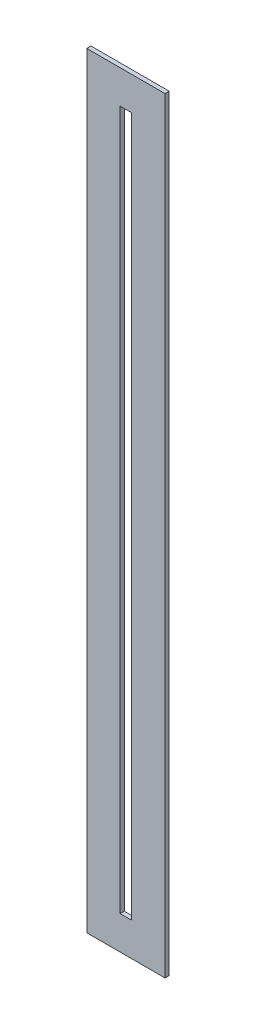
ISO-10303-21;
HEADER;
FILE_DESCRIPTION(('STEP AP214'),'2;1');
FILE_NAME('part.step','',(''),(''),'','','');
FILE_SCHEMA(('AUTOMOTIVE_DESIGN { 1 0 10303 214 1 1 1 1 }'));
ENDSEC;
DATA;
#1=APPLICATION_CONTEXT('core data for automotive mechanical design processes');
#2=APPLICATION_PROTOCOL_DEFINITION('international standard','automotive_design',2000,#1);
#3=PRODUCT_CONTEXT('',#1,'mechanical');
#4=PRODUCT('Part','Part','',(#3));
#5=PRODUCT_RELATED_PRODUCT_CATEGORY('part','',(#4));
#6=PRODUCT_DEFINITION_FORMATION('','',#4);
#7=PRODUCT_DEFINITION_CONTEXT('part definition',#1,'design');
#8=PRODUCT_DEFINITION('design','',#6,#7);
#9=PRODUCT_DEFINITION_SHAPE('','',#8);
#10=(LENGTH_UNIT() NAMED_UNIT(*) SI_UNIT(.MILLI.,.METRE.));
#11=(NAMED_UNIT(*) PLANE_ANGLE_UNIT() SI_UNIT($,.RADIAN.));
#12=(NAMED_UNIT(*) SI_UNIT($,.STERADIAN.) SOLID_ANGLE_UNIT());
#13=UNCERTAINTY_MEASURE_WITH_UNIT(LENGTH_MEASURE(1.E-05),#10,'distance_accuracy_value','');
#14=(GEOMETRIC_REPRESENTATION_CONTEXT(3) GLOBAL_UNCERTAINTY_ASSIGNED_CONTEXT((#13)) GLOBAL_UNIT_ASSIGNED_CONTEXT((#10,
#11,#12)) REPRESENTATION_CONTEXT('',''));
#15=CARTESIAN_POINT('',(0.,0.,0.));
#16=DIRECTION('',(0.,0.,1.));
#17=DIRECTION('',(1.,0.,0.));
#18=AXIS2_PLACEMENT_3D('',#15,#16,#17);
#19=CARTESIAN_POINT('',(0.,0.,3.175));
#20=DIRECTION('',(0.,0.,1.));
#21=DIRECTION('',(1.,0.,0.));
#22=AXIS2_PLACEMENT_3D('',#19,#20,#21);
#23=PLANE('',#22);
#24=DIRECTION('',(0.,-1.,0.));
#25=VECTOR('',#24,1.);
#26=CARTESIAN_POINT('',(-25.4,-25.4,3.175));
#27=LINE('',#26,#25);
#28=CARTESIAN_POINT('',(-25.4,558.8,3.175));
#29=VERTEX_POINT('',#28);
#30=CARTESIAN_POINT('',(-25.4,-25.4,3.175));
#31=VERTEX_POINT('',#30);
#32=EDGE_CURVE('E134',#29,#31,#27,.T.);
#33=ORIENTED_EDGE('',*,*,#32,.T.);
#34=DIRECTION('',(1.,0.,0.));
#35=VECTOR('',#34,1.);
#36=CARTESIAN_POINT('',(34.29,-25.4,3.175));
#37=LINE('',#36,#35);
#38=CARTESIAN_POINT('',(34.29,-25.4,3.175));
#39=VERTEX_POINT('',#38);
#40=EDGE_CURVE('E137',#31,#39,#37,.T.);
#41=ORIENTED_EDGE('',*,*,#40,.T.);
#42=DIRECTION('',(0.,1.,0.));
#43=VECTOR('',#42,1.);
#44=CARTESIAN_POINT('',(34.29,-25.4,3.175));
#45=LINE('',#44,#43);
#46=CARTESIAN_POINT('',(34.29,558.8,3.175));
#47=VERTEX_POINT('',#46);
#48=EDGE_CURVE('E140',#39,#47,#45,.T.);
#49=ORIENTED_EDGE('',*,*,#48,.T.);
#50=DIRECTION('',(-1.,0.,0.));
#51=VECTOR('',#50,1.);
#52=CARTESIAN_POINT('',(34.29,558.8,3.175));
#53=LINE('',#52,#51);
#54=EDGE_CURVE('E142',#47,#29,#53,.T.);
#55=ORIENTED_EDGE('',*,*,#54,.T.);
#56=EDGE_LOOP('',(#33,#41,#49,#55));
#57=FACE_BOUND('',#56,.T.);
#58=DIRECTION('',(1.,0.,0.));
#59=VECTOR('',#58,1.);
#60=CARTESIAN_POINT('',(0.,0.,3.175));
#61=LINE('',#60,#59);
#62=CARTESIAN_POINT('',(0.,0.,3.175));
#63=VERTEX_POINT('',#62);
#64=CARTESIAN_POINT('',(8.89000000000001,0.,3.175));
#65=VERTEX_POINT('',#64);
#66=EDGE_CURVE('E106',#63,#65,#61,.T.);
#67=ORIENTED_EDGE('',*,*,#66,.F.);
#68=DIRECTION('',(0.,-1.,0.));
#69=VECTOR('',#68,1.);
#70=CARTESIAN_POINT('',(0.,0.,3.175));
#71=LINE('',#70,#69);
#72=CARTESIAN_POINT('',(0.,533.4,3.175));
#73=VERTEX_POINT('',#72);
#74=EDGE_CURVE('E98',#73,#63,#71,.T.);
#75=ORIENTED_EDGE('',*,*,#74,.F.);
#76=DIRECTION('',(-1.,0.,0.));
#77=VECTOR('',#76,1.);
#78=CARTESIAN_POINT('',(0.,533.4,3.175));
#79=LINE('',#78,#77);
#80=CARTESIAN_POINT('',(8.89000000000001,533.4,3.175));
#81=VERTEX_POINT('',#80);
#82=EDGE_CURVE('E120',#81,#73,#79,.T.);
#83=ORIENTED_EDGE('',*,*,#82,.F.);
#84=DIRECTION('',(0.,1.,0.));
#85=VECTOR('',#84,1.);
#86=CARTESIAN_POINT('',(8.89000000000001,0.,3.175));
#87=LINE('',#86,#85);
#88=EDGE_CURVE('E118',#65,#81,#87,.T.);
#89=ORIENTED_EDGE('',*,*,#88,.F.);
#90=EDGE_LOOP('',(#67,#75,#83,#89));
#91=FACE_BOUND('',#90,.T.);
#92=ADVANCED_FACE('F33',(#57,#91),#23,.T.);
#93=CARTESIAN_POINT('',(0.,0.,0.));
#94=DIRECTION('',(0.,0.,1.));
#95=DIRECTION('',(1.,0.,0.));
#96=AXIS2_PLACEMENT_3D('',#93,#94,#95);
#97=PLANE('',#96);
#98=DIRECTION('',(0.,-1.,0.));
#99=VECTOR('',#98,1.);
#100=CARTESIAN_POINT('',(-25.4,-25.4,0.));
#101=LINE('',#100,#99);
#102=CARTESIAN_POINT('',(-25.4,558.8,0.));
#103=VERTEX_POINT('',#102);
#104=CARTESIAN_POINT('',(-25.4,-25.4,0.));
#105=VERTEX_POINT('',#104);
#106=EDGE_CURVE('E114',#103,#105,#101,.T.);
#107=ORIENTED_EDGE('',*,*,#106,.F.);
#108=DIRECTION('',(-1.,0.,0.));
#109=VECTOR('',#108,1.);
#110=CARTESIAN_POINT('',(34.29,558.8,0.));
#111=LINE('',#110,#109);
#112=CARTESIAN_POINT('',(34.29,558.8,0.));
#113=VERTEX_POINT('',#112);
#114=EDGE_CURVE('E138',#113,#103,#111,.T.);
#115=ORIENTED_EDGE('',*,*,#114,.F.);
#116=DIRECTION('',(0.,1.,0.));
#117=VECTOR('',#116,1.);
#118=CARTESIAN_POINT('',(34.29,-25.4,0.));
#119=LINE('',#118,#117);
#120=CARTESIAN_POINT('',(34.29,-25.4,0.));
#121=VERTEX_POINT('',#120);
#122=EDGE_CURVE('E149',#121,#113,#119,.T.);
#123=ORIENTED_EDGE('',*,*,#122,.F.);
#124=DIRECTION('',(1.,0.,0.));
#125=VECTOR('',#124,1.);
#126=CARTESIAN_POINT('',(34.29,-25.4,0.));
#127=LINE('',#126,#125);
#128=EDGE_CURVE('E147',#105,#121,#127,.T.);
#129=ORIENTED_EDGE('',*,*,#128,.F.);
#130=EDGE_LOOP('',(#107,#115,#123,#129));
#131=FACE_BOUND('',#130,.T.);
#132=DIRECTION('',(0.,-1.,0.));
#133=VECTOR('',#132,1.);
#134=CARTESIAN_POINT('',(0.,0.,0.));
#135=LINE('',#134,#133);
#136=CARTESIAN_POINT('',(0.,533.4,0.));
#137=VERTEX_POINT('',#136);
#138=CARTESIAN_POINT('',(0.,0.,0.));
#139=VERTEX_POINT('',#138);
#140=EDGE_CURVE('E56',#137,#139,#135,.T.);
#141=ORIENTED_EDGE('',*,*,#140,.T.);
#142=DIRECTION('',(1.,0.,0.));
#143=VECTOR('',#142,1.);
#144=CARTESIAN_POINT('',(0.,0.,0.));
#145=LINE('',#144,#143);
#146=CARTESIAN_POINT('',(8.89000000000001,0.,0.));
#147=VERTEX_POINT('',#146);
#148=EDGE_CURVE('E113',#139,#147,#145,.T.);
#149=ORIENTED_EDGE('',*,*,#148,.T.);
#150=DIRECTION('',(0.,1.,0.));
#151=VECTOR('',#150,1.);
#152=CARTESIAN_POINT('',(8.89000000000001,0.,0.));
#153=LINE('',#152,#151);
#154=CARTESIAN_POINT('',(8.89000000000001,533.4,0.));
#155=VERTEX_POINT('',#154);
#156=EDGE_CURVE('E126',#147,#155,#153,.T.);
#157=ORIENTED_EDGE('',*,*,#156,.T.);
#158=DIRECTION('',(-1.,0.,0.));
#159=VECTOR('',#158,1.);
#160=CARTESIAN_POINT('',(0.,533.4,0.));
#161=LINE('',#160,#159);
#162=EDGE_CURVE('E107',#155,#137,#161,.T.);
#163=ORIENTED_EDGE('',*,*,#162,.T.);
#164=EDGE_LOOP('',(#141,#149,#157,#163));
#165=FACE_BOUND('',#164,.T.);
#166=ADVANCED_FACE('F167',(#131,#165),#97,.F.);
#167=CARTESIAN_POINT('',(-25.4,-25.4,3.175));
#168=DIRECTION('',(1.,0.,0.));
#169=DIRECTION('',(0.,0.,-1.));
#170=AXIS2_PLACEMENT_3D('',#167,#168,#169);
#171=PLANE('',#170);
#172=ORIENTED_EDGE('',*,*,#106,.T.);
#173=DIRECTION('',(0.,0.,-1.));
#174=VECTOR('',#173,1.);
#175=CARTESIAN_POINT('',(-25.4,-25.4,3.175));
#176=LINE('',#175,#174);
#177=EDGE_CURVE('E11',#31,#105,#176,.T.);
#178=ORIENTED_EDGE('',*,*,#177,.F.);
#179=ORIENTED_EDGE('',*,*,#32,.F.);
#180=DIRECTION('',(0.,0.,-1.));
#181=VECTOR('',#180,1.);
#182=CARTESIAN_POINT('',(-25.4,558.8,3.175));
#183=LINE('',#182,#181);
#184=EDGE_CURVE('E144',#29,#103,#183,.T.);
#185=ORIENTED_EDGE('',*,*,#184,.T.);
#186=EDGE_LOOP('',(#172,#178,#179,#185));
#187=FACE_BOUND('',#186,.T.);
#188=ADVANCED_FACE('F35',(#187),#171,.F.);
#189=CARTESIAN_POINT('',(34.29,-25.4,3.175));
#190=DIRECTION('',(0.,1.,0.));
#191=DIRECTION('',(-1.,0.,0.));
#192=AXIS2_PLACEMENT_3D('',#189,#190,#191);
#193=PLANE('',#192);
#194=ORIENTED_EDGE('',*,*,#128,.T.);
#195=DIRECTION('',(0.,0.,-1.));
#196=VECTOR('',#195,1.);
#197=CARTESIAN_POINT('',(34.29,-25.4,3.175));
#198=LINE('',#197,#196);
#199=EDGE_CURVE('E41',#39,#121,#198,.T.);
#200=ORIENTED_EDGE('',*,*,#199,.F.);
#201=ORIENTED_EDGE('',*,*,#40,.F.);
#202=ORIENTED_EDGE('',*,*,#177,.T.);
#203=EDGE_LOOP('',(#194,#200,#201,#202));
#204=FACE_BOUND('',#203,.T.);
#205=ADVANCED_FACE('F177',(#204),#193,.F.);
#206=CARTESIAN_POINT('',(34.29,-25.4,3.175));
#207=DIRECTION('',(-1.,0.,0.));
#208=DIRECTION('',(0.,0.,1.));
#209=AXIS2_PLACEMENT_3D('',#206,#207,#208);
#210=PLANE('',#209);
#211=ORIENTED_EDGE('',*,*,#122,.T.);
#212=DIRECTION('',(0.,0.,-1.));
#213=VECTOR('',#212,1.);
#214=CARTESIAN_POINT('',(34.29,558.8,3.175));
#215=LINE('',#214,#213);
#216=EDGE_CURVE('E154',#47,#113,#215,.T.);
#217=ORIENTED_EDGE('',*,*,#216,.F.);
#218=ORIENTED_EDGE('',*,*,#48,.F.);
#219=ORIENTED_EDGE('',*,*,#199,.T.);
#220=EDGE_LOOP('',(#211,#217,#218,#219));
#221=FACE_BOUND('',#220,.T.);
#222=ADVANCED_FACE('F161',(#221),#210,.F.);
#223=CARTESIAN_POINT('',(34.29,558.8,3.175));
#224=DIRECTION('',(0.,-1.,0.));
#225=DIRECTION('',(0.,0.,-1.));
#226=AXIS2_PLACEMENT_3D('',#223,#224,#225);
#227=PLANE('',#226);
#228=ORIENTED_EDGE('',*,*,#114,.T.);
#229=ORIENTED_EDGE('',*,*,#184,.F.);
#230=ORIENTED_EDGE('',*,*,#54,.F.);
#231=ORIENTED_EDGE('',*,*,#216,.T.);
#232=EDGE_LOOP('',(#228,#229,#230,#231));
#233=FACE_BOUND('',#232,.T.);
#234=ADVANCED_FACE('F171',(#233),#227,.F.);
#235=CARTESIAN_POINT('',(0.,0.,3.175));
#236=DIRECTION('',(1.,0.,0.));
#237=DIRECTION('',(0.,0.,-1.));
#238=AXIS2_PLACEMENT_3D('',#235,#236,#237);
#239=PLANE('',#238);
#240=ORIENTED_EDGE('',*,*,#140,.F.);
#241=DIRECTION('',(0.,0.,-1.));
#242=VECTOR('',#241,1.);
#243=CARTESIAN_POINT('',(0.,533.4,3.175));
#244=LINE('',#243,#242);
#245=EDGE_CURVE('E102',#73,#137,#244,.T.);
#246=ORIENTED_EDGE('',*,*,#245,.F.);
#247=ORIENTED_EDGE('',*,*,#74,.T.);
#248=DIRECTION('',(0.,0.,-1.));
#249=VECTOR('',#248,1.);
#250=CARTESIAN_POINT('',(0.,0.,3.175));
#251=LINE('',#250,#249);
#252=EDGE_CURVE('E101',#63,#139,#251,.T.);
#253=ORIENTED_EDGE('',*,*,#252,.T.);
#254=EDGE_LOOP('',(#240,#246,#247,#253));
#255=FACE_BOUND('',#254,.T.);
#256=ADVANCED_FACE('F100',(#255),#239,.T.);
#257=CARTESIAN_POINT('',(0.,0.,3.175));
#258=DIRECTION('',(0.,1.,0.));
#259=DIRECTION('',(0.,0.,1.));
#260=AXIS2_PLACEMENT_3D('',#257,#258,#259);
#261=PLANE('',#260);
#262=ORIENTED_EDGE('',*,*,#148,.F.);
#263=ORIENTED_EDGE('',*,*,#252,.F.);
#264=ORIENTED_EDGE('',*,*,#66,.T.);
#265=DIRECTION('',(0.,0.,-1.));
#266=VECTOR('',#265,1.);
#267=CARTESIAN_POINT('',(8.89000000000001,0.,3.175));
#268=LINE('',#267,#266);
#269=EDGE_CURVE('E115',#65,#147,#268,.T.);
#270=ORIENTED_EDGE('',*,*,#269,.T.);
#271=EDGE_LOOP('',(#262,#263,#264,#270));
#272=FACE_BOUND('',#271,.T.);
#273=ADVANCED_FACE('F110',(#272),#261,.T.);
#274=CARTESIAN_POINT('',(8.89000000000001,0.,3.175));
#275=DIRECTION('',(-1.,0.,0.));
#276=DIRECTION('',(0.,0.,1.));
#277=AXIS2_PLACEMENT_3D('',#274,#275,#276);
#278=PLANE('',#277);
#279=ORIENTED_EDGE('',*,*,#156,.F.);
#280=ORIENTED_EDGE('',*,*,#269,.F.);
#281=ORIENTED_EDGE('',*,*,#88,.T.);
#282=DIRECTION('',(0.,0.,-1.));
#283=VECTOR('',#282,1.);
#284=CARTESIAN_POINT('',(8.89000000000001,533.4,3.175));
#285=LINE('',#284,#283);
#286=EDGE_CURVE('E48',#81,#155,#285,.T.);
#287=ORIENTED_EDGE('',*,*,#286,.T.);
#288=EDGE_LOOP('',(#279,#280,#281,#287));
#289=FACE_BOUND('',#288,.T.);
#290=ADVANCED_FACE('F200',(#289),#278,.T.);
#291=CARTESIAN_POINT('',(0.,533.4,3.175));
#292=DIRECTION('',(0.,-1.,0.));
#293=DIRECTION('',(0.,0.,-1.));
#294=AXIS2_PLACEMENT_3D('',#291,#292,#293);
#295=PLANE('',#294);
#296=ORIENTED_EDGE('',*,*,#162,.F.);
#297=ORIENTED_EDGE('',*,*,#286,.F.);
#298=ORIENTED_EDGE('',*,*,#82,.T.);
#299=ORIENTED_EDGE('',*,*,#245,.T.);
#300=EDGE_LOOP('',(#296,#297,#298,#299));
#301=FACE_BOUND('',#300,.T.);
#302=ADVANCED_FACE('F204',(#301),#295,.T.);
#303=CLOSED_SHELL('',(#92,#166,#188,#205,#222,#234,#256,#273,#290,#302));
#304=MANIFOLD_SOLID_BREP('B2',#303);
#305=ADVANCED_BREP_SHAPE_REPRESENTATION('',(#18,#304),#14);
#306=SHAPE_DEFINITION_REPRESENTATION(#9,#305);
ENDSEC;
END-ISO-10303-21;
